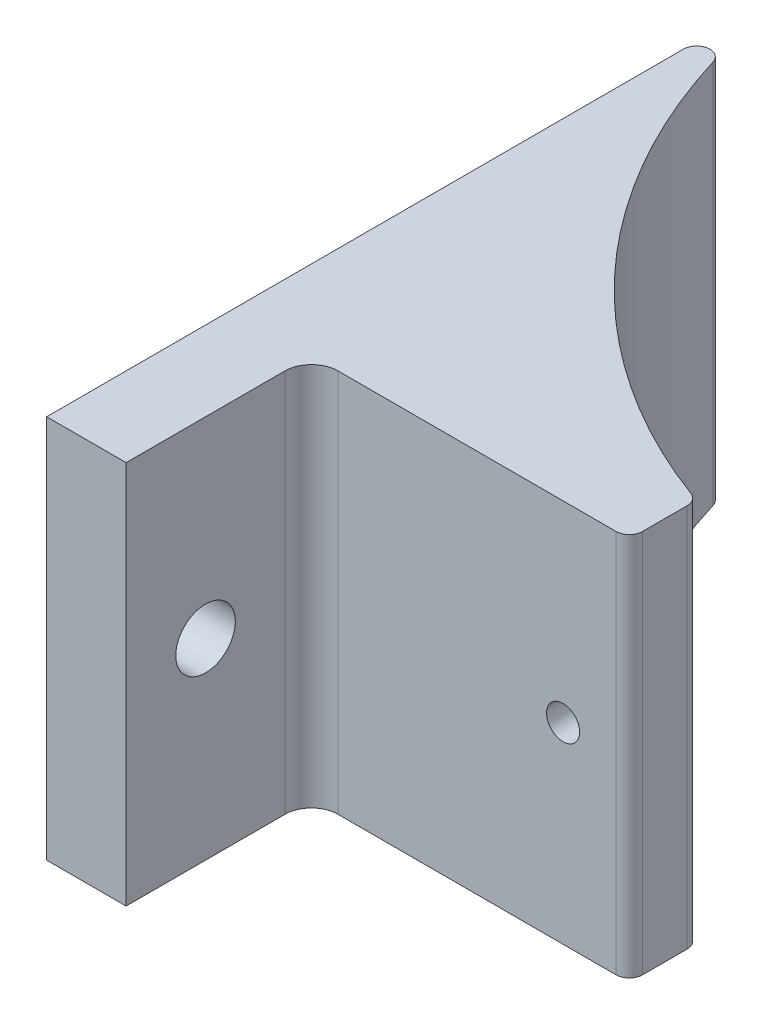
ISO-10303-21;
HEADER;
FILE_DESCRIPTION(('STEP AP214'),'2;1');
FILE_NAME('part.step','',(''),(''),'','','');
FILE_SCHEMA(('AUTOMOTIVE_DESIGN { 1 0 10303 214 1 1 1 1 }'));
ENDSEC;
DATA;
#1=APPLICATION_CONTEXT('core data for automotive mechanical design processes');
#2=APPLICATION_PROTOCOL_DEFINITION('international standard','automotive_design',2000,#1);
#3=PRODUCT_CONTEXT('',#1,'mechanical');
#4=PRODUCT('Part','Part','',(#3));
#5=PRODUCT_RELATED_PRODUCT_CATEGORY('part','',(#4));
#6=PRODUCT_DEFINITION_FORMATION('','',#4);
#7=PRODUCT_DEFINITION_CONTEXT('part definition',#1,'design');
#8=PRODUCT_DEFINITION('design','',#6,#7);
#9=PRODUCT_DEFINITION_SHAPE('','',#8);
#10=(LENGTH_UNIT() NAMED_UNIT(*) SI_UNIT(.MILLI.,.METRE.));
#11=(NAMED_UNIT(*) PLANE_ANGLE_UNIT() SI_UNIT($,.RADIAN.));
#12=(NAMED_UNIT(*) SI_UNIT($,.STERADIAN.) SOLID_ANGLE_UNIT());
#13=UNCERTAINTY_MEASURE_WITH_UNIT(LENGTH_MEASURE(1.E-05),#10,'distance_accuracy_value','');
#14=(GEOMETRIC_REPRESENTATION_CONTEXT(3) GLOBAL_UNCERTAINTY_ASSIGNED_CONTEXT((#13)) GLOBAL_UNIT_ASSIGNED_CONTEXT((#10,
#11,#12)) REPRESENTATION_CONTEXT('',''));
#15=CARTESIAN_POINT('',(0.,0.,0.));
#16=DIRECTION('',(0.,0.,1.));
#17=DIRECTION('',(1.,0.,0.));
#18=AXIS2_PLACEMENT_3D('',#15,#16,#17);
#19=CARTESIAN_POINT('',(-45.,14.5,61.5));
#20=DIRECTION('',(0.,0.,-1.));
#21=DIRECTION('',(-1.,0.,0.));
#22=AXIS2_PLACEMENT_3D('',#19,#20,#21);
#23=PLANE('',#22);
#24=DIRECTION('',(1.,0.,0.));
#25=VECTOR('',#24,1.);
#26=CARTESIAN_POINT('',(-45.,-14.5,61.5));
#27=LINE('',#26,#25);
#28=CARTESIAN_POINT('',(-45.,-14.5,61.5));
#29=VERTEX_POINT('',#28);
#30=CARTESIAN_POINT('',(-39.,-14.5,61.5));
#31=VERTEX_POINT('',#30);
#32=EDGE_CURVE('E147',#29,#31,#27,.T.);
#33=ORIENTED_EDGE('',*,*,#32,.T.);
#34=DIRECTION('',(0.,-1.,0.));
#35=VECTOR('',#34,1.);
#36=CARTESIAN_POINT('',(-39.,14.5,61.5));
#37=LINE('',#36,#35);
#38=CARTESIAN_POINT('',(-39.,14.5,61.5));
#39=VERTEX_POINT('',#38);
#40=EDGE_CURVE('E11',#39,#31,#37,.T.);
#41=ORIENTED_EDGE('',*,*,#40,.F.);
#42=DIRECTION('',(1.,0.,0.));
#43=VECTOR('',#42,1.);
#44=CARTESIAN_POINT('',(-45.,14.5,61.5));
#45=LINE('',#44,#43);
#46=CARTESIAN_POINT('',(-45.,14.5,61.5));
#47=VERTEX_POINT('',#46);
#48=EDGE_CURVE('E166',#47,#39,#45,.T.);
#49=ORIENTED_EDGE('',*,*,#48,.F.);
#50=DIRECTION('',(0.,-1.,0.));
#51=VECTOR('',#50,1.);
#52=CARTESIAN_POINT('',(-45.,14.5,61.5));
#53=LINE('',#52,#51);
#54=EDGE_CURVE('E143',#47,#29,#53,.T.);
#55=ORIENTED_EDGE('',*,*,#54,.T.);
#56=EDGE_LOOP('',(#33,#41,#49,#55));
#57=FACE_BOUND('',#56,.T.);
#58=ADVANCED_FACE('F34',(#57),#23,.F.);
#59=CARTESIAN_POINT('',(-39.,14.5,49.5));
#60=DIRECTION('',(-1.,0.,0.));
#61=DIRECTION('',(0.,0.,1.));
#62=AXIS2_PLACEMENT_3D('',#59,#60,#61);
#63=PLANE('',#62);
#64=CARTESIAN_POINT('',(-39.,0.,55.5));
#65=DIRECTION('',(1.,0.,0.));
#66=DIRECTION('',(0.,0.,-1.));
#67=AXIS2_PLACEMENT_3D('',#64,#65,#66);
#68=CIRCLE('',#67,2.25);
#69=CARTESIAN_POINT('',(-39.,0.,53.25));
#70=VERTEX_POINT('',#69);
#71=EDGE_CURVE('E214',#70,#70,#68,.T.);
#72=ORIENTED_EDGE('',*,*,#71,.F.);
#73=EDGE_LOOP('',(#72));
#74=FACE_BOUND('',#73,.T.);
#75=DIRECTION('',(0.,0.,-1.));
#76=VECTOR('',#75,1.);
#77=CARTESIAN_POINT('',(-39.,-14.5,49.5));
#78=LINE('',#77,#76);
#79=CARTESIAN_POINT('',(-39.,-14.5,49.5));
#80=VERTEX_POINT('',#79);
#81=EDGE_CURVE('E150',#31,#80,#78,.T.);
#82=ORIENTED_EDGE('',*,*,#81,.T.);
#83=DIRECTION('',(0.,-1.,0.));
#84=VECTOR('',#83,1.);
#85=CARTESIAN_POINT('',(-39.,14.5,49.5));
#86=LINE('',#85,#84);
#87=CARTESIAN_POINT('',(-39.,14.5,49.5));
#88=VERTEX_POINT('',#87);
#89=EDGE_CURVE('E47',#88,#80,#86,.T.);
#90=ORIENTED_EDGE('',*,*,#89,.F.);
#91=DIRECTION('',(0.,0.,-1.));
#92=VECTOR('',#91,1.);
#93=CARTESIAN_POINT('',(-39.,14.5,49.5));
#94=LINE('',#93,#92);
#95=EDGE_CURVE('E104',#39,#88,#94,.T.);
#96=ORIENTED_EDGE('',*,*,#95,.F.);
#97=ORIENTED_EDGE('',*,*,#40,.T.);
#98=EDGE_LOOP('',(#82,#90,#96,#97));
#99=FACE_BOUND('',#98,.T.);
#100=ADVANCED_FACE('F238',(#74,#99),#63,.F.);
#101=CARTESIAN_POINT('',(-37.,14.5,49.5));
#102=DIRECTION('',(0.,-1.,0.));
#103=DIRECTION('',(0.,0.,-1.));
#104=AXIS2_PLACEMENT_3D('',#101,#102,#103);
#105=CYLINDRICAL_SURFACE('',#104,2.00000000000001);
#106=CARTESIAN_POINT('',(-37.,-14.5,49.5));
#107=DIRECTION('',(0.,-1.,0.));
#108=DIRECTION('',(0.,0.,-1.));
#109=AXIS2_PLACEMENT_3D('',#106,#107,#108);
#110=CIRCLE('',#109,2.00000000000001);
#111=CARTESIAN_POINT('',(-37.,-14.5,47.5));
#112=VERTEX_POINT('',#111);
#113=EDGE_CURVE('E153',#80,#112,#110,.T.);
#114=ORIENTED_EDGE('',*,*,#113,.T.);
#115=DIRECTION('',(0.,-1.,0.));
#116=VECTOR('',#115,1.);
#117=CARTESIAN_POINT('',(-37.,14.5,47.5));
#118=LINE('',#117,#116);
#119=CARTESIAN_POINT('',(-37.,14.5,47.5));
#120=VERTEX_POINT('',#119);
#121=EDGE_CURVE('E179',#120,#112,#118,.T.);
#122=ORIENTED_EDGE('',*,*,#121,.F.);
#123=CARTESIAN_POINT('',(-37.,14.5,49.5));
#124=DIRECTION('',(0.,-1.,0.));
#125=DIRECTION('',(0.,0.,-1.));
#126=AXIS2_PLACEMENT_3D('',#123,#124,#125);
#127=CIRCLE('',#126,2.00000000000001);
#128=EDGE_CURVE('E188',#88,#120,#127,.T.);
#129=ORIENTED_EDGE('',*,*,#128,.F.);
#130=ORIENTED_EDGE('',*,*,#89,.T.);
#131=EDGE_LOOP('',(#114,#122,#129,#130));
#132=FACE_BOUND('',#131,.T.);
#133=ADVANCED_FACE('F186',(#132),#105,.F.);
#134=CARTESIAN_POINT('',(-16.,14.5,47.5));
#135=DIRECTION('',(0.,0.,-1.));
#136=DIRECTION('',(-1.,0.,0.));
#137=AXIS2_PLACEMENT_3D('',#134,#135,#136);
#138=PLANE('',#137);
#139=CARTESIAN_POINT('',(-20.,0.,47.5));
#140=DIRECTION('',(0.,0.,-1.));
#141=DIRECTION('',(-1.,0.,0.));
#142=AXIS2_PLACEMENT_3D('',#139,#140,#141);
#143=CIRCLE('',#142,1.25);
#144=CARTESIAN_POINT('',(-21.25,0.,47.5));
#145=VERTEX_POINT('',#144);
#146=EDGE_CURVE('E217',#145,#145,#143,.T.);
#147=ORIENTED_EDGE('',*,*,#146,.T.);
#148=EDGE_LOOP('',(#147));
#149=FACE_BOUND('',#148,.T.);
#150=DIRECTION('',(1.,0.,0.));
#151=VECTOR('',#150,1.);
#152=CARTESIAN_POINT('',(-16.,-14.5,47.5));
#153=LINE('',#152,#151);
#154=CARTESIAN_POINT('',(-16.,-14.5,47.5));
#155=VERTEX_POINT('',#154);
#156=EDGE_CURVE('E155',#112,#155,#153,.T.);
#157=ORIENTED_EDGE('',*,*,#156,.T.);
#158=DIRECTION('',(0.,-1.,0.));
#159=VECTOR('',#158,1.);
#160=CARTESIAN_POINT('',(-16.,14.5,47.5));
#161=LINE('',#160,#159);
#162=CARTESIAN_POINT('',(-16.,14.5,47.5));
#163=VERTEX_POINT('',#162);
#164=EDGE_CURVE('E176',#163,#155,#161,.T.);
#165=ORIENTED_EDGE('',*,*,#164,.F.);
#166=DIRECTION('',(1.,0.,0.));
#167=VECTOR('',#166,1.);
#168=CARTESIAN_POINT('',(-16.,14.5,47.5));
#169=LINE('',#168,#167);
#170=EDGE_CURVE('E206',#120,#163,#169,.T.);
#171=ORIENTED_EDGE('',*,*,#170,.F.);
#172=ORIENTED_EDGE('',*,*,#121,.T.);
#173=EDGE_LOOP('',(#157,#165,#171,#172));
#174=FACE_BOUND('',#173,.T.);
#175=ADVANCED_FACE('F197',(#149,#174),#138,.F.);
#176=CARTESIAN_POINT('',(-16.,14.5,46.5));
#177=DIRECTION('',(0.,-1.,0.));
#178=DIRECTION('',(0.,0.,-1.));
#179=AXIS2_PLACEMENT_3D('',#176,#177,#178);
#180=CYLINDRICAL_SURFACE('',#179,1.);
#181=CARTESIAN_POINT('',(-16.,-14.5,46.5));
#182=DIRECTION('',(0.,1.,0.));
#183=DIRECTION('',(0.,0.,-1.));
#184=AXIS2_PLACEMENT_3D('',#181,#182,#183);
#185=CIRCLE('',#184,1.);
#186=CARTESIAN_POINT('',(-15.,-14.5,46.5));
#187=VERTEX_POINT('',#186);
#188=EDGE_CURVE('E157',#155,#187,#185,.T.);
#189=ORIENTED_EDGE('',*,*,#188,.T.);
#190=DIRECTION('',(0.,-1.,0.));
#191=VECTOR('',#190,1.);
#192=CARTESIAN_POINT('',(-15.,14.5,46.5));
#193=LINE('',#192,#191);
#194=CARTESIAN_POINT('',(-15.,14.5,46.5));
#195=VERTEX_POINT('',#194);
#196=EDGE_CURVE('E173',#195,#187,#193,.T.);
#197=ORIENTED_EDGE('',*,*,#196,.F.);
#198=CARTESIAN_POINT('',(-16.,14.5,46.5));
#199=DIRECTION('',(0.,1.,0.));
#200=DIRECTION('',(0.,0.,-1.));
#201=AXIS2_PLACEMENT_3D('',#198,#199,#200);
#202=CIRCLE('',#201,1.);
#203=EDGE_CURVE('E203',#163,#195,#202,.T.);
#204=ORIENTED_EDGE('',*,*,#203,.F.);
#205=ORIENTED_EDGE('',*,*,#164,.T.);
#206=EDGE_LOOP('',(#189,#197,#204,#205));
#207=FACE_BOUND('',#206,.T.);
#208=ADVANCED_FACE('F201',(#207),#180,.T.);
#209=CARTESIAN_POINT('',(-15.,14.5,43.1277173056956));
#210=DIRECTION('',(-1.,0.,0.));
#211=DIRECTION('',(0.,0.,1.));
#212=AXIS2_PLACEMENT_3D('',#209,#210,#211);
#213=PLANE('',#212);
#214=DIRECTION('',(0.,0.,-1.));
#215=VECTOR('',#214,1.);
#216=CARTESIAN_POINT('',(-15.,-14.5,43.1277173056956));
#217=LINE('',#216,#215);
#218=CARTESIAN_POINT('',(-15.,-14.5,43.1277173056956));
#219=VERTEX_POINT('',#218);
#220=EDGE_CURVE('E159',#187,#219,#217,.T.);
#221=ORIENTED_EDGE('',*,*,#220,.T.);
#222=DIRECTION('',(0.,-1.,0.));
#223=VECTOR('',#222,1.);
#224=CARTESIAN_POINT('',(-15.,14.5,43.1277173056956));
#225=LINE('',#224,#223);
#226=CARTESIAN_POINT('',(-15.,14.5,43.1277173056956));
#227=VERTEX_POINT('',#226);
#228=EDGE_CURVE('E170',#227,#219,#225,.T.);
#229=ORIENTED_EDGE('',*,*,#228,.F.);
#230=DIRECTION('',(0.,0.,-1.));
#231=VECTOR('',#230,1.);
#232=CARTESIAN_POINT('',(-15.,14.5,43.1277173056956));
#233=LINE('',#232,#231);
#234=EDGE_CURVE('E205',#195,#227,#233,.T.);
#235=ORIENTED_EDGE('',*,*,#234,.F.);
#236=ORIENTED_EDGE('',*,*,#196,.T.);
#237=EDGE_LOOP('',(#221,#229,#235,#236));
#238=FACE_BOUND('',#237,.T.);
#239=ADVANCED_FACE('F251',(#238),#213,.F.);
#240=CARTESIAN_POINT('',(-16.,14.5,43.1277173056956));
#241=DIRECTION('',(0.,-1.,0.));
#242=DIRECTION('',(0.,0.,-1.));
#243=AXIS2_PLACEMENT_3D('',#240,#241,#242);
#244=CYLINDRICAL_SURFACE('',#243,0.999999999999999);
#245=CARTESIAN_POINT('',(-16.,-14.5,43.1277173056956));
#246=DIRECTION('',(0.,1.,0.));
#247=DIRECTION('',(0.,0.,-1.));
#248=AXIS2_PLACEMENT_3D('',#245,#246,#247);
#249=CIRCLE('',#248,0.999999999999999);
#250=CARTESIAN_POINT('',(-15.6521739130435,-14.5,42.1901582338327));
#251=VERTEX_POINT('',#250);
#252=EDGE_CURVE('E161',#219,#251,#249,.T.);
#253=ORIENTED_EDGE('',*,*,#252,.T.);
#254=DIRECTION('',(0.,-1.,0.));
#255=VECTOR('',#254,1.);
#256=CARTESIAN_POINT('',(-15.6521739130435,14.5,42.1901582338327));
#257=LINE('',#256,#255);
#258=CARTESIAN_POINT('',(-15.6521739130435,14.5,42.1901582338327));
#259=VERTEX_POINT('',#258);
#260=EDGE_CURVE('E138',#259,#251,#257,.T.);
#261=ORIENTED_EDGE('',*,*,#260,.F.);
#262=CARTESIAN_POINT('',(-16.,14.5,43.1277173056956));
#263=DIRECTION('',(0.,1.,0.));
#264=DIRECTION('',(0.,0.,-1.));
#265=AXIS2_PLACEMENT_3D('',#262,#263,#264);
#266=CIRCLE('',#265,0.999999999999999);
#267=EDGE_CURVE('E129',#227,#259,#266,.T.);
#268=ORIENTED_EDGE('',*,*,#267,.F.);
#269=ORIENTED_EDGE('',*,*,#228,.T.);
#270=EDGE_LOOP('',(#253,#261,#268,#269));
#271=FACE_BOUND('',#270,.T.);
#272=ADVANCED_FACE('F248',(#271),#244,.T.);
#273=CARTESIAN_POINT('',(0.,14.5,0.));
#274=DIRECTION('',(0.,-1.,0.));
#275=DIRECTION('',(0.,0.,-1.));
#276=AXIS2_PLACEMENT_3D('',#273,#274,#275);
#277=CYLINDRICAL_SURFACE('',#276,45.);
#278=CARTESIAN_POINT('',(-18.75,0.,40.9076704298839));
#279=CARTESIAN_POINT('',(-18.75000371977,0.0654298293426151,40.9076688782379));
#280=CARTESIAN_POINT('',(-18.7551634020061,0.130918675361713,40.9053050103236));
#281=CARTESIAN_POINT('',(-18.7755916216446,0.260015175051849,40.8959323118311));
#282=CARTESIAN_POINT('',(-18.7908747835055,0.323619967926815,40.8889167613811));
#283=CARTESIAN_POINT('',(-18.8308466340271,0.446958394916444,40.8705235351526));
#284=CARTESIAN_POINT('',(-18.8555132620818,0.506700727197052,40.8591560903167));
#285=CARTESIAN_POINT('',(-18.9132613340812,0.620966420718284,40.8324570992021));
#286=CARTESIAN_POINT('',(-18.9463415311369,0.675490553648371,40.8171261403098));
#287=CARTESIAN_POINT('',(-19.0210356936832,0.779998918232935,40.7823730513589));
#288=CARTESIAN_POINT('',(-19.0629095891796,0.829755072699573,40.7628256509429));
#289=CARTESIAN_POINT('',(-19.153016592035,0.921553184513096,40.7205652094889));
#290=CARTESIAN_POINT('',(-19.2012517860005,0.963592599777985,40.6978511295897));
#291=CARTESIAN_POINT('',(-19.3070736861498,1.04263189249149,40.6477627133129));
#292=CARTESIAN_POINT('',(-19.3651081669966,1.07888400154272,40.6201553786922));
#293=CARTESIAN_POINT('',(-19.4853545213289,1.14115292902753,40.5626109507869));
#294=CARTESIAN_POINT('',(-19.5475680963573,1.16716554845829,40.5326729077423));
#295=CARTESIAN_POINT('',(-19.6806035102797,1.2107159009364,40.4682566841103));
#296=CARTESIAN_POINT('',(-19.751684267385,1.2272248196673,40.4336164534924));
#297=CARTESIAN_POINT('',(-19.8951035697038,1.24769763801705,40.3632412465897));
#298=CARTESIAN_POINT('',(-19.9674425919884,1.25165667029398,40.3275058509804));
#299=CARTESIAN_POINT('',(-20.116652165078,1.24693354878817,40.2532944538487));
#300=CARTESIAN_POINT('',(-20.1934870576225,1.23735088969905,40.2148010686641));
#301=CARTESIAN_POINT('',(-20.3444886335419,1.20407946088106,40.1386215520656));
#302=CARTESIAN_POINT('',(-20.4186546059514,1.18038696154365,40.1009356368172));
#303=CARTESIAN_POINT('',(-20.562886170862,1.11886907608748,40.0271700204918));
#304=CARTESIAN_POINT('',(-20.6329017930598,1.08090095460402,39.9911108056962));
#305=CARTESIAN_POINT('',(-20.7655656769275,0.991365615866048,39.9223854958392));
#306=CARTESIAN_POINT('',(-20.8282159828773,0.939802185002554,39.8897184595571));
#307=CARTESIAN_POINT('',(-20.9395443669028,0.827980073295636,39.8313842250963));
#308=CARTESIAN_POINT('',(-20.988883394976,0.768552638170147,39.8053918400916));
#309=CARTESIAN_POINT('',(-21.0764825722418,0.640086227968517,39.7590787861803));
#310=CARTESIAN_POINT('',(-21.114754196684,0.571057319007286,39.7387522434344));
#311=CARTESIAN_POINT('',(-21.1741695045088,0.434387213121738,39.7071220919134));
#312=CARTESIAN_POINT('',(-21.1968240582539,0.367586275083326,39.6950249745752));
#313=CARTESIAN_POINT('',(-21.2306177471829,0.230348754786613,39.6769611533629));
#314=CARTESIAN_POINT('',(-21.2417661589251,0.159915149465488,39.6709895109913));
#315=CARTESIAN_POINT('',(-21.2513768540764,0.0252603213075999,39.6658417738351));
#316=CARTESIAN_POINT('',(-21.2510255747695,-0.0388551095552196,39.6660301409515));
#317=CARTESIAN_POINT('',(-21.2405636673185,-0.166042547337054,39.6716333216582));
#318=CARTESIAN_POINT('',(-21.230454920065,-0.229114752969266,39.6770471279706));
#319=CARTESIAN_POINT('',(-21.2013494913488,-0.350824652166418,39.6926068643013));
#320=CARTESIAN_POINT('',(-21.1825844818213,-0.409534211442804,39.7026294269471));
#321=CARTESIAN_POINT('',(-21.1370524549571,-0.522820057224441,39.7268885719923));
#322=CARTESIAN_POINT('',(-21.1102840546964,-0.577395627364044,39.7411258826633));
#323=CARTESIAN_POINT('',(-21.0480279694168,-0.684230552129603,39.7741351081748));
#324=CARTESIAN_POINT('',(-21.0121354089737,-0.736188251572718,39.7931165907405));
#325=CARTESIAN_POINT('',(-20.9337611066189,-0.833361605539284,39.8344023050741));
#326=CARTESIAN_POINT('',(-20.8912768227131,-0.878574645842158,39.8567078185702));
#327=CARTESIAN_POINT('',(-20.7961711406486,-0.966028513906295,39.9064209416357));
#328=CARTESIAN_POINT('',(-20.7429534159281,-1.00745548186886,39.9341184620894));
#329=CARTESIAN_POINT('',(-20.6314813763885,-1.08082826473149,39.9918231690253));
#330=CARTESIAN_POINT('',(-20.5732247540261,-1.11276970576991,40.0218314129966));
#331=CARTESIAN_POINT('',(-20.4464178117641,-1.16985636021799,40.0867759730125));
#332=CARTESIAN_POINT('',(-20.3774420228317,-1.19385707061651,40.1218899999595));
#333=CARTESIAN_POINT('',(-20.2368024814968,-1.22950911974228,40.1930098838662));
#334=CARTESIAN_POINT('',(-20.1651376105671,-1.24115525926911,40.2290161097743));
#335=CARTESIAN_POINT('',(-20.0156876184519,-1.25230189658373,40.3035941521464));
#336=CARTESIAN_POINT('',(-19.9378311365047,-1.25087488357082,40.3421654178774));
#337=CARTESIAN_POINT('',(-19.7831867364862,-1.23351014558057,40.4182254871615));
#338=CARTESIAN_POINT('',(-19.7063990040786,-1.2175699305335,40.4557141038227));
#339=CARTESIAN_POINT('',(-19.5560990227199,-1.17117259401894,40.5285822054546));
#340=CARTESIAN_POINT('',(-19.4825917066179,-1.1406943657583,40.5639585394475));
#341=CARTESIAN_POINT('',(-19.3415460158264,-1.06551231312095,40.6314005034842));
#342=CARTESIAN_POINT('',(-19.2740053574962,-1.02081396166683,40.6634674009582));
#343=CARTESIAN_POINT('',(-19.1519811596634,-0.921481533775528,40.7210740105329));
#344=CARTESIAN_POINT('',(-19.0969225552329,-0.8677276630901,40.7469090080258));
#345=CARTESIAN_POINT('',(-18.9968158162541,-0.749729172409754,40.7936765728944));
#346=CARTESIAN_POINT('',(-18.9517633266101,-0.685489137654694,40.8146112733071));
#347=CARTESIAN_POINT('',(-18.877922495446,-0.555396732887745,40.8488131428026));
#348=CARTESIAN_POINT('',(-18.8479516749436,-0.490361260798492,40.862640880282));
#349=CARTESIAN_POINT('',(-18.7994511488557,-0.355384931328326,40.8849771933527));
#350=CARTESIAN_POINT('',(-18.7808958567372,-0.285455438353261,40.8934976650801));
#351=CARTESIAN_POINT('',(-18.7623619125548,-0.179007428146118,40.9020025658867));
#352=CARTESIAN_POINT('',(-18.7577339430414,-0.143403304912856,40.9041248374759));
#353=CARTESIAN_POINT('',(-18.751551998685,-0.0718720535293275,40.9069591802351));
#354=CARTESIAN_POINT('',(-18.7499979564844,-0.0359449324741118,40.9076712823057));
#355=CARTESIAN_POINT('',(-18.75,0.,40.9076704298839));
#356=B_SPLINE_CURVE_WITH_KNOTS('',3,(#278,#279,#280,#281,#282,#283,#284,#285,#286,#287,#288,
#289,#290,#291,#292,#293,#294,#295,#296,#297,#298,#299,#300,#301,#302,#303,#304,#305,#306,#307,
#308,#309,#310,#311,#312,#313,#314,#315,#316,#317,#318,#319,#320,#321,#322,#323,#324,#325,#326,
#327,#328,#329,#330,#331,#332,#333,#334,#335,#336,#337,#338,#339,#340,#341,#342,#343,#344,#345,
#346,#347,#348,#349,#350,#351,#352,#353,#354,#355),.UNSPECIFIED.,.T.,.F.,(4,2,2,2,2,2,2,2,2,2,2,
2,2,2,2,2,2,2,2,2,2,2,2,2,2,2,2,2,2,2,2,2,2,2,2,2,2,2,4),(0.,0.196150421936985,0.39258482410792,
0.588560233288099,0.784506615864497,0.98736702549772,1.19029414283144,1.41072990502991,
1.63125596943518,1.87254987436756,2.11393735116936,2.37215285230468,2.63043663702295,
2.89137469084979,3.1522401481845,3.3953411971095,3.63818927519442,3.85169208714848,
4.06502263266119,4.25642037777103,4.44778123560897,4.63429380937988,4.82083862972432,
5.01784761344013,5.21493276026081,5.43276402449825,5.65069557727904,5.89276369461797,
6.134933641636,6.39441101464219,6.6539329152811,6.91383275100122,7.17363267940274,
7.41580043422333,7.65786257966305,7.87549737151857,8.09264256686779,8.20040332743355,
8.30816172665501),.UNSPECIFIED.);
#357=CARTESIAN_POINT('',(-18.75,0.,40.9076704298839));
#358=VERTEX_POINT('',#357);
#359=EDGE_CURVE('E37',#358,#358,#356,.T.);
#360=ORIENTED_EDGE('',*,*,#359,.T.);
#361=EDGE_LOOP('',(#360));
#362=FACE_BOUND('',#361,.T.);
#363=CARTESIAN_POINT('',(0.,-14.5,0.));
#364=DIRECTION('',(0.,-1.,0.));
#365=DIRECTION('',(0.,0.,1.));
#366=AXIS2_PLACEMENT_3D('',#363,#364,#365);
#367=CIRCLE('',#366,45.);
#368=CARTESIAN_POINT('',(-43.0434782608696,-14.5,13.1247468244553));
#369=VERTEX_POINT('',#368);
#370=EDGE_CURVE('E137',#251,#369,#367,.T.);
#371=ORIENTED_EDGE('',*,*,#370,.T.);
#372=DIRECTION('',(0.,-1.,0.));
#373=VECTOR('',#372,1.);
#374=CARTESIAN_POINT('',(-43.0434782608696,14.5,13.1247468244553));
#375=LINE('',#374,#373);
#376=CARTESIAN_POINT('',(-43.0434782608696,14.5,13.1247468244553));
#377=VERTEX_POINT('',#376);
#378=EDGE_CURVE('E134',#377,#369,#375,.T.);
#379=ORIENTED_EDGE('',*,*,#378,.F.);
#380=CARTESIAN_POINT('',(0.,14.5,0.));
#381=DIRECTION('',(0.,-1.,0.));
#382=DIRECTION('',(0.,0.,1.));
#383=AXIS2_PLACEMENT_3D('',#380,#381,#382);
#384=CIRCLE('',#383,45.);
#385=EDGE_CURVE('E123',#259,#377,#384,.T.);
#386=ORIENTED_EDGE('',*,*,#385,.F.);
#387=ORIENTED_EDGE('',*,*,#260,.T.);
#388=EDGE_LOOP('',(#371,#379,#386,#387));
#389=FACE_BOUND('',#388,.T.);
#390=ADVANCED_FACE('F135',(#362,#389),#277,.F.);
#391=CARTESIAN_POINT('',(-44.,14.5,13.4164078649987));
#392=DIRECTION('',(0.,-1.,0.));
#393=DIRECTION('',(0.,0.,-1.));
#394=AXIS2_PLACEMENT_3D('',#391,#392,#393);
#395=CYLINDRICAL_SURFACE('',#394,0.999999999999999);
#396=CARTESIAN_POINT('',(-44.,-14.5,13.4164078649987));
#397=DIRECTION('',(0.,1.,0.));
#398=DIRECTION('',(0.,0.,-1.));
#399=AXIS2_PLACEMENT_3D('',#396,#397,#398);
#400=CIRCLE('',#399,0.999999999999999);
#401=CARTESIAN_POINT('',(-45.,-14.5,13.4164078649987));
#402=VERTEX_POINT('',#401);
#403=EDGE_CURVE('E90',#369,#402,#400,.T.);
#404=ORIENTED_EDGE('',*,*,#403,.T.);
#405=DIRECTION('',(0.,-1.,0.));
#406=VECTOR('',#405,1.);
#407=CARTESIAN_POINT('',(-45.,14.5,13.4164078649987));
#408=LINE('',#407,#406);
#409=CARTESIAN_POINT('',(-45.,14.5,13.4164078649987));
#410=VERTEX_POINT('',#409);
#411=EDGE_CURVE('E139',#410,#402,#408,.T.);
#412=ORIENTED_EDGE('',*,*,#411,.F.);
#413=CARTESIAN_POINT('',(-44.,14.5,13.4164078649987));
#414=DIRECTION('',(0.,1.,0.));
#415=DIRECTION('',(0.,0.,-1.));
#416=AXIS2_PLACEMENT_3D('',#413,#414,#415);
#417=CIRCLE('',#416,0.999999999999999);
#418=EDGE_CURVE('E127',#377,#410,#417,.T.);
#419=ORIENTED_EDGE('',*,*,#418,.F.);
#420=ORIENTED_EDGE('',*,*,#378,.T.);
#421=EDGE_LOOP('',(#404,#412,#419,#420));
#422=FACE_BOUND('',#421,.T.);
#423=ADVANCED_FACE('F141',(#422),#395,.T.);
#424=CARTESIAN_POINT('',(-45.,14.5,13.4164078649987));
#425=DIRECTION('',(1.,0.,0.));
#426=DIRECTION('',(0.,0.,-1.));
#427=AXIS2_PLACEMENT_3D('',#424,#425,#426);
#428=PLANE('',#427);
#429=CARTESIAN_POINT('',(-45.,0.,55.5));
#430=DIRECTION('',(1.,0.,0.));
#431=DIRECTION('',(0.,0.,-1.));
#432=AXIS2_PLACEMENT_3D('',#429,#430,#431);
#433=CIRCLE('',#432,2.25);
#434=CARTESIAN_POINT('',(-45.,0.,53.25));
#435=VERTEX_POINT('',#434);
#436=EDGE_CURVE('E151',#435,#435,#433,.T.);
#437=ORIENTED_EDGE('',*,*,#436,.T.);
#438=EDGE_LOOP('',(#437));
#439=FACE_BOUND('',#438,.T.);
#440=DIRECTION('',(0.,0.,1.));
#441=VECTOR('',#440,1.);
#442=CARTESIAN_POINT('',(-45.,-14.5,13.4164078649987));
#443=LINE('',#442,#441);
#444=EDGE_CURVE('E96',#402,#29,#443,.T.);
#445=ORIENTED_EDGE('',*,*,#444,.T.);
#446=ORIENTED_EDGE('',*,*,#54,.F.);
#447=DIRECTION('',(0.,0.,1.));
#448=VECTOR('',#447,1.);
#449=CARTESIAN_POINT('',(-45.,14.5,13.4164078649987));
#450=LINE('',#449,#448);
#451=EDGE_CURVE('E55',#410,#47,#450,.T.);
#452=ORIENTED_EDGE('',*,*,#451,.F.);
#453=ORIENTED_EDGE('',*,*,#411,.T.);
#454=EDGE_LOOP('',(#445,#446,#452,#453));
#455=FACE_BOUND('',#454,.T.);
#456=ADVANCED_FACE('F299',(#439,#455),#428,.F.);
#457=CARTESIAN_POINT('',(-37.,14.5,49.5));
#458=DIRECTION('',(0.,-1.,0.));
#459=DIRECTION('',(0.,0.,-1.));
#460=AXIS2_PLACEMENT_3D('',#457,#458,#459);
#461=PLANE('',#460);
#462=ORIENTED_EDGE('',*,*,#48,.T.);
#463=ORIENTED_EDGE('',*,*,#95,.T.);
#464=ORIENTED_EDGE('',*,*,#128,.T.);
#465=ORIENTED_EDGE('',*,*,#170,.T.);
#466=ORIENTED_EDGE('',*,*,#203,.T.);
#467=ORIENTED_EDGE('',*,*,#234,.T.);
#468=ORIENTED_EDGE('',*,*,#267,.T.);
#469=ORIENTED_EDGE('',*,*,#385,.T.);
#470=ORIENTED_EDGE('',*,*,#418,.T.);
#471=ORIENTED_EDGE('',*,*,#451,.T.);
#472=EDGE_LOOP('',(#462,#463,#464,#465,#466,#467,#468,#469,#470,#471));
#473=FACE_BOUND('',#472,.T.);
#474=ADVANCED_FACE('F125',(#473),#461,.F.);
#475=CARTESIAN_POINT('',(-37.,-14.5,49.5));
#476=DIRECTION('',(0.,-1.,0.));
#477=DIRECTION('',(0.,0.,-1.));
#478=AXIS2_PLACEMENT_3D('',#475,#476,#477);
#479=PLANE('',#478);
#480=ORIENTED_EDGE('',*,*,#32,.F.);
#481=ORIENTED_EDGE('',*,*,#444,.F.);
#482=ORIENTED_EDGE('',*,*,#403,.F.);
#483=ORIENTED_EDGE('',*,*,#370,.F.);
#484=ORIENTED_EDGE('',*,*,#252,.F.);
#485=ORIENTED_EDGE('',*,*,#220,.F.);
#486=ORIENTED_EDGE('',*,*,#188,.F.);
#487=ORIENTED_EDGE('',*,*,#156,.F.);
#488=ORIENTED_EDGE('',*,*,#113,.F.);
#489=ORIENTED_EDGE('',*,*,#81,.F.);
#490=EDGE_LOOP('',(#480,#481,#482,#483,#484,#485,#486,#487,#488,#489));
#491=FACE_BOUND('',#490,.T.);
#492=ADVANCED_FACE('F192',(#491),#479,.T.);
#493=CARTESIAN_POINT('',(-45.,0.,55.5));
#494=DIRECTION('',(1.,0.,0.));
#495=DIRECTION('',(0.,0.,-1.));
#496=AXIS2_PLACEMENT_3D('',#493,#494,#495);
#497=CYLINDRICAL_SURFACE('',#496,2.25);
#498=ORIENTED_EDGE('',*,*,#436,.F.);
#499=EDGE_LOOP('',(#498));
#500=FACE_BOUND('',#499,.T.);
#501=ORIENTED_EDGE('',*,*,#71,.T.);
#502=EDGE_LOOP('',(#501));
#503=FACE_BOUND('',#502,.T.);
#504=ADVANCED_FACE('F230',(#500,#503),#497,.F.);
#505=CARTESIAN_POINT('',(-20.,0.,12.4164078649988));
#506=DIRECTION('',(0.,0.,1.));
#507=DIRECTION('',(1.,0.,0.));
#508=AXIS2_PLACEMENT_3D('',#505,#506,#507);
#509=CYLINDRICAL_SURFACE('',#508,1.25);
#510=ORIENTED_EDGE('',*,*,#359,.F.);
#511=EDGE_LOOP('',(#510));
#512=FACE_BOUND('',#511,.T.);
#513=ORIENTED_EDGE('',*,*,#146,.F.);
#514=EDGE_LOOP('',(#513));
#515=FACE_BOUND('',#514,.T.);
#516=ADVANCED_FACE('F227',(#512,#515),#509,.F.);
#517=CLOSED_SHELL('',(#58,#100,#133,#175,#208,#239,#272,#390,#423,#456,#474,#492,#504,#516));
#518=MANIFOLD_SOLID_BREP('B2',#517);
#519=ADVANCED_BREP_SHAPE_REPRESENTATION('',(#18,#518),#14);
#520=SHAPE_DEFINITION_REPRESENTATION(#9,#519);
ENDSEC;
END-ISO-10303-21;
